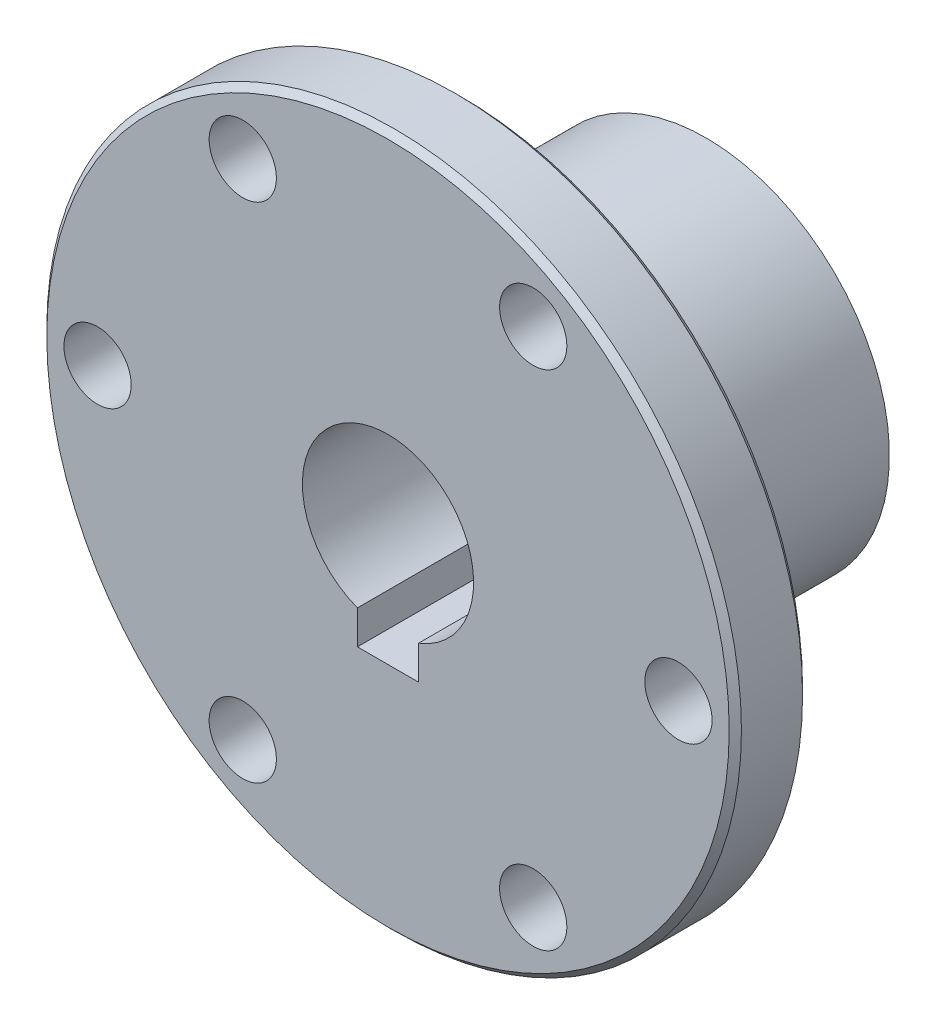
ISO-10303-21;
HEADER;
FILE_DESCRIPTION(('STEP AP214'),'2;1');
FILE_NAME('part.step','',(''),(''),'','','');
FILE_SCHEMA(('AUTOMOTIVE_DESIGN { 1 0 10303 214 1 1 1 1 }'));
ENDSEC;
DATA;
#1=APPLICATION_CONTEXT('core data for automotive mechanical design processes');
#2=APPLICATION_PROTOCOL_DEFINITION('international standard','automotive_design',2000,#1);
#3=PRODUCT_CONTEXT('',#1,'mechanical');
#4=PRODUCT('Part','Part','',(#3));
#5=PRODUCT_RELATED_PRODUCT_CATEGORY('part','',(#4));
#6=PRODUCT_DEFINITION_FORMATION('','',#4);
#7=PRODUCT_DEFINITION_CONTEXT('part definition',#1,'design');
#8=PRODUCT_DEFINITION('design','',#6,#7);
#9=PRODUCT_DEFINITION_SHAPE('','',#8);
#10=(LENGTH_UNIT() NAMED_UNIT(*) SI_UNIT(.MILLI.,.METRE.));
#11=(NAMED_UNIT(*) PLANE_ANGLE_UNIT() SI_UNIT($,.RADIAN.));
#12=(NAMED_UNIT(*) SI_UNIT($,.STERADIAN.) SOLID_ANGLE_UNIT());
#13=UNCERTAINTY_MEASURE_WITH_UNIT(LENGTH_MEASURE(1.E-05),#10,'distance_accuracy_value','');
#14=(GEOMETRIC_REPRESENTATION_CONTEXT(3) GLOBAL_UNCERTAINTY_ASSIGNED_CONTEXT((#13)) GLOBAL_UNIT_ASSIGNED_CONTEXT((#10,
#11,#12)) REPRESENTATION_CONTEXT('',''));
#15=CARTESIAN_POINT('',(0.,0.,0.));
#16=DIRECTION('',(0.,0.,1.));
#17=DIRECTION('',(1.,0.,0.));
#18=AXIS2_PLACEMENT_3D('',#15,#16,#17);
#19=CARTESIAN_POINT('',(0.,0.,26.));
#20=DIRECTION('',(0.,0.,-1.));
#21=DIRECTION('',(-1.,0.,0.));
#22=AXIS2_PLACEMENT_3D('',#19,#20,#21);
#23=CYLINDRICAL_SURFACE('',#22,28.4);
#24=CARTESIAN_POINT('',(0.,0.,20.5));
#25=DIRECTION('',(0.,0.,1.));
#26=DIRECTION('',(1.,0.,0.));
#27=AXIS2_PLACEMENT_3D('',#24,#25,#26);
#28=CIRCLE('',#27,28.4);
#29=CARTESIAN_POINT('',(-28.4,0.,20.5));
#30=VERTEX_POINT('',#29);
#31=EDGE_CURVE('E161',#30,#30,#28,.T.);
#32=CARTESIAN_POINT('',(0.,0.,25.5000000000001));
#33=DIRECTION('',(0.,0.,1.));
#34=DIRECTION('',(1.,0.,0.));
#35=AXIS2_PLACEMENT_3D('',#32,#33,#34);
#36=CIRCLE('',#35,28.4);
#37=CARTESIAN_POINT('',(-28.4,0.,25.5000000000001));
#38=VERTEX_POINT('',#37);
#39=EDGE_CURVE('E157',#38,#38,#36,.F.);
#40=CARTESIAN_POINT('',(-28.4,0.,20.5));
#41=CARTESIAN_POINT('',(-28.4,0.,20.5520833333334));
#42=CARTESIAN_POINT('',(-28.4,0.,20.6041666666667));
#43=CARTESIAN_POINT('',(-28.4,0.,20.7083333333334));
#44=CARTESIAN_POINT('',(-28.4,0.,20.7604166666667));
#45=CARTESIAN_POINT('',(-28.4,0.,20.8645833333334));
#46=CARTESIAN_POINT('',(-28.4,0.,20.9166666666667));
#47=CARTESIAN_POINT('',(-28.4,0.,21.0208333333334));
#48=CARTESIAN_POINT('',(-28.4,0.,21.0729166666667));
#49=CARTESIAN_POINT('',(-28.4,0.,21.1770833333334));
#50=CARTESIAN_POINT('',(-28.4,0.,21.2291666666667));
#51=CARTESIAN_POINT('',(-28.4,0.,21.3333333333334));
#52=CARTESIAN_POINT('',(-28.4,0.,21.3854166666667));
#53=CARTESIAN_POINT('',(-28.4,0.,21.4895833333334));
#54=CARTESIAN_POINT('',(-28.4,0.,21.5416666666667));
#55=CARTESIAN_POINT('',(-28.4,0.,21.6458333333334));
#56=CARTESIAN_POINT('',(-28.4,0.,21.6979166666667));
#57=CARTESIAN_POINT('',(-28.4,0.,21.8020833333334));
#58=CARTESIAN_POINT('',(-28.4,0.,21.8541666666667));
#59=CARTESIAN_POINT('',(-28.4,0.,21.9583333333334));
#60=CARTESIAN_POINT('',(-28.4,0.,22.0104166666667));
#61=CARTESIAN_POINT('',(-28.4,0.,22.1145833333334));
#62=CARTESIAN_POINT('',(-28.4,0.,22.1666666666667));
#63=CARTESIAN_POINT('',(-28.4,0.,22.2708333333334));
#64=CARTESIAN_POINT('',(-28.4,0.,22.3229166666667));
#65=CARTESIAN_POINT('',(-28.4,0.,22.4270833333334));
#66=CARTESIAN_POINT('',(-28.4,0.,22.4791666666667));
#67=CARTESIAN_POINT('',(-28.4,0.,22.5833333333334));
#68=CARTESIAN_POINT('',(-28.4,0.,22.6354166666667));
#69=CARTESIAN_POINT('',(-28.4,0.,22.7395833333334));
#70=CARTESIAN_POINT('',(-28.4,0.,22.7916666666667));
#71=CARTESIAN_POINT('',(-28.4,0.,22.8958333333334));
#72=CARTESIAN_POINT('',(-28.4,0.,22.9479166666667));
#73=CARTESIAN_POINT('',(-28.4,0.,23.0520833333334));
#74=CARTESIAN_POINT('',(-28.4,0.,23.1041666666667));
#75=CARTESIAN_POINT('',(-28.4,0.,23.2083333333334));
#76=CARTESIAN_POINT('',(-28.4,0.,23.2604166666667));
#77=CARTESIAN_POINT('',(-28.4,0.,23.3645833333334));
#78=CARTESIAN_POINT('',(-28.4,0.,23.4166666666667));
#79=CARTESIAN_POINT('',(-28.4,0.,23.5208333333334));
#80=CARTESIAN_POINT('',(-28.4,0.,23.5729166666667));
#81=CARTESIAN_POINT('',(-28.4,0.,23.6770833333334));
#82=CARTESIAN_POINT('',(-28.4,0.,23.7291666666667));
#83=CARTESIAN_POINT('',(-28.4,0.,23.8333333333334));
#84=CARTESIAN_POINT('',(-28.4,0.,23.8854166666667));
#85=CARTESIAN_POINT('',(-28.4,0.,23.9895833333334));
#86=CARTESIAN_POINT('',(-28.4,0.,24.0416666666667));
#87=CARTESIAN_POINT('',(-28.4,0.,24.1458333333334));
#88=CARTESIAN_POINT('',(-28.4,0.,24.1979166666667));
#89=CARTESIAN_POINT('',(-28.4,0.,24.3020833333334));
#90=CARTESIAN_POINT('',(-28.4,0.,24.3541666666667));
#91=CARTESIAN_POINT('',(-28.4,0.,24.4583333333334));
#92=CARTESIAN_POINT('',(-28.4,0.,24.5104166666667));
#93=CARTESIAN_POINT('',(-28.4,0.,24.6145833333334));
#94=CARTESIAN_POINT('',(-28.4,0.,24.6666666666667));
#95=CARTESIAN_POINT('',(-28.4,0.,24.7708333333334));
#96=CARTESIAN_POINT('',(-28.4,0.,24.8229166666667));
#97=CARTESIAN_POINT('',(-28.4,0.,24.9270833333334));
#98=CARTESIAN_POINT('',(-28.4,0.,24.9791666666667));
#99=CARTESIAN_POINT('',(-28.4,0.,25.0833333333334));
#100=CARTESIAN_POINT('',(-28.4,0.,25.1354166666667));
#101=CARTESIAN_POINT('',(-28.4,0.,25.2395833333334));
#102=CARTESIAN_POINT('',(-28.4,0.,25.2916666666667));
#103=CARTESIAN_POINT('',(-28.4,0.,25.3958333333334));
#104=CARTESIAN_POINT('',(-28.4,0.,25.4479166666667));
#105=CARTESIAN_POINT('',(-28.4,0.,25.5000000000001));
#106=B_SPLINE_CURVE_WITH_KNOTS('',3,(#40,#41,#42,#43,#44,#45,#46,#47,#48,#49,#50,#51,#52,#53,
#54,#55,#56,#57,#58,#59,#60,#61,#62,#63,#64,#65,#66,#67,#68,#69,#70,#71,#72,#73,#74,#75,#76,#77,
#78,#79,#80,#81,#82,#83,#84,#85,#86,#87,#88,#89,#90,#91,#92,#93,#94,#95,#96,#97,#98,#99,#100,
#101,#102,#103,#104,#105),.UNSPECIFIED.,.F.,.F.,(4,2,2,2,2,2,2,2,2,2,2,2,2,2,2,2,2,2,2,2,2,2,2,
2,2,2,2,2,2,2,2,2,4),(0.,0.15625,0.3125,0.46875,0.625000000000001,0.781250000000001,
0.937500000000004,1.09375,1.25,1.40625,1.5625,1.71875,1.87500000000001,2.03125000000001,
2.18750000000001,2.34375000000001,2.50000000000001,2.65625000000001,2.81250000000001,
2.96875000000001,3.12500000000001,3.28125000000001,3.43750000000001,3.59375000000001,
3.75000000000001,3.90625000000002,4.06250000000002,4.21875000000002,4.37500000000002,
4.53125000000002,4.68750000000002,4.84375000000002,5.00000000000002),.UNSPECIFIED.);
#107=EDGE_CURVE('BSEAM49',#30,#38,#106,.T.);
#108=ORIENTED_EDGE('',*,*,#31,.T.);
#109=ORIENTED_EDGE('',*,*,#39,.T.);
#110=ORIENTED_EDGE('',*,*,#107,.T.);
#111=ORIENTED_EDGE('',*,*,#107,.F.);
#112=EDGE_LOOP('',(#108,#110,#109,#111));
#113=FACE_BOUND('',#112,.T.);
#114=ADVANCED_FACE('F49',(#113),#23,.T.);
#115=CARTESIAN_POINT('',(0.,0.,26.));
#116=DIRECTION('',(0.,0.,1.));
#117=DIRECTION('',(1.,0.,0.));
#118=AXIS2_PLACEMENT_3D('',#115,#116,#117);
#119=PLANE('',#118);
#120=CARTESIAN_POINT('',(11.8750000000002,-20.5681033398803,26.));
#121=DIRECTION('',(0.,0.,1.));
#122=DIRECTION('',(1.,0.,0.));
#123=AXIS2_PLACEMENT_3D('',#120,#121,#122);
#124=CIRCLE('',#123,2.74999999999999);
#125=CARTESIAN_POINT('',(14.6250000000002,-20.5681033398803,26.));
#126=VERTEX_POINT('',#125);
#127=EDGE_CURVE('E192',#126,#126,#124,.T.);
#128=ORIENTED_EDGE('',*,*,#127,.F.);
#129=EDGE_LOOP('',(#128));
#130=FACE_BOUND('',#129,.T.);
#131=CARTESIAN_POINT('',(-11.8749999999998,-20.5681033398805,26.));
#132=DIRECTION('',(0.,0.,1.));
#133=DIRECTION('',(1.,0.,0.));
#134=AXIS2_PLACEMENT_3D('',#131,#132,#133);
#135=CIRCLE('',#134,2.74999999999999);
#136=CARTESIAN_POINT('',(-9.12499999999982,-20.5681033398805,26.));
#137=VERTEX_POINT('',#136);
#138=EDGE_CURVE('E177',#137,#137,#135,.T.);
#139=ORIENTED_EDGE('',*,*,#138,.F.);
#140=EDGE_LOOP('',(#139));
#141=FACE_BOUND('',#140,.T.);
#142=CARTESIAN_POINT('',(-23.75,0.,26.));
#143=DIRECTION('',(0.,0.,1.));
#144=DIRECTION('',(1.,0.,0.));
#145=AXIS2_PLACEMENT_3D('',#142,#143,#144);
#146=CIRCLE('',#145,2.74999999999999);
#147=CARTESIAN_POINT('',(-21.,0.,26.));
#148=VERTEX_POINT('',#147);
#149=EDGE_CURVE('E176',#148,#148,#146,.T.);
#150=ORIENTED_EDGE('',*,*,#149,.F.);
#151=EDGE_LOOP('',(#150));
#152=FACE_BOUND('',#151,.T.);
#153=CARTESIAN_POINT('',(-11.8750000000001,20.5681033398804,26.));
#154=DIRECTION('',(0.,0.,1.));
#155=DIRECTION('',(1.,0.,0.));
#156=AXIS2_PLACEMENT_3D('',#153,#154,#155);
#157=CIRCLE('',#156,2.74999999999999);
#158=CARTESIAN_POINT('',(-9.12500000000011,20.5681033398804,26.));
#159=VERTEX_POINT('',#158);
#160=EDGE_CURVE('E172',#159,#159,#157,.T.);
#161=ORIENTED_EDGE('',*,*,#160,.F.);
#162=EDGE_LOOP('',(#161));
#163=FACE_BOUND('',#162,.T.);
#164=CARTESIAN_POINT('',(11.875,20.5681033398804,26.));
#165=DIRECTION('',(0.,0.,1.));
#166=DIRECTION('',(1.,0.,0.));
#167=AXIS2_PLACEMENT_3D('',#164,#165,#166);
#168=CIRCLE('',#167,2.74999999999999);
#169=CARTESIAN_POINT('',(14.6249999999999,20.5681033398804,26.));
#170=VERTEX_POINT('',#169);
#171=EDGE_CURVE('E171',#170,#170,#168,.T.);
#172=ORIENTED_EDGE('',*,*,#171,.F.);
#173=EDGE_LOOP('',(#172));
#174=FACE_BOUND('',#173,.T.);
#175=CARTESIAN_POINT('',(23.75,0.,26.));
#176=DIRECTION('',(0.,0.,1.));
#177=DIRECTION('',(1.,0.,0.));
#178=AXIS2_PLACEMENT_3D('',#175,#176,#177);
#179=CIRCLE('',#178,2.74999999999999);
#180=CARTESIAN_POINT('',(26.5,0.,26.));
#181=VERTEX_POINT('',#180);
#182=EDGE_CURVE('E208',#181,#181,#179,.T.);
#183=ORIENTED_EDGE('',*,*,#182,.F.);
#184=EDGE_LOOP('',(#183));
#185=FACE_BOUND('',#184,.T.);
#186=CARTESIAN_POINT('',(0.,0.,26.));
#187=DIRECTION('',(0.,0.,1.));
#188=DIRECTION('',(1.,0.,0.));
#189=AXIS2_PLACEMENT_3D('',#186,#187,#188);
#190=CIRCLE('',#189,27.9000000000001);
#191=CARTESIAN_POINT('',(27.9000000000001,0.,26.));
#192=VERTEX_POINT('',#191);
#193=EDGE_CURVE('E13',#192,#192,#190,.T.);
#194=ORIENTED_EDGE('',*,*,#193,.T.);
#195=EDGE_LOOP('',(#194));
#196=FACE_BOUND('',#195,.T.);
#197=DIRECTION('',(-1.,0.,0.));
#198=VECTOR('',#197,1.);
#199=CARTESIAN_POINT('',(2.5,-9.3,26.));
#200=LINE('',#199,#198);
#201=CARTESIAN_POINT('',(2.5,-9.3,26.));
#202=VERTEX_POINT('',#201);
#203=CARTESIAN_POINT('',(-2.5,-9.3,26.));
#204=VERTEX_POINT('',#203);
#205=EDGE_CURVE('E101',#202,#204,#200,.T.);
#206=ORIENTED_EDGE('',*,*,#205,.T.);
#207=DIRECTION('',(0.,1.,0.));
#208=VECTOR('',#207,1.);
#209=CARTESIAN_POINT('',(-2.5,-6.53834841531101,26.));
#210=LINE('',#209,#208);
#211=CARTESIAN_POINT('',(-2.5,-6.53834841531101,26.));
#212=VERTEX_POINT('',#211);
#213=EDGE_CURVE('E111',#204,#212,#210,.T.);
#214=ORIENTED_EDGE('',*,*,#213,.T.);
#215=CARTESIAN_POINT('',(0.,0.,26.));
#216=DIRECTION('',(0.,0.,-1.));
#217=DIRECTION('',(-1.,0.,0.));
#218=AXIS2_PLACEMENT_3D('',#215,#216,#217);
#219=CIRCLE('',#218,7.);
#220=CARTESIAN_POINT('',(2.5,-6.53834841531101,26.));
#221=VERTEX_POINT('',#220);
#222=EDGE_CURVE('E73',#212,#221,#219,.T.);
#223=ORIENTED_EDGE('',*,*,#222,.T.);
#224=DIRECTION('',(0.,-1.,0.));
#225=VECTOR('',#224,1.);
#226=CARTESIAN_POINT('',(2.5,-6.53834841531101,26.));
#227=LINE('',#226,#225);
#228=EDGE_CURVE('E108',#221,#202,#227,.T.);
#229=ORIENTED_EDGE('',*,*,#228,.T.);
#230=EDGE_LOOP('',(#206,#214,#223,#229));
#231=FACE_BOUND('',#230,.T.);
#232=ADVANCED_FACE('F116',(#130,#141,#152,#163,#174,#185,#196,#231),#119,.T.);
#233=CARTESIAN_POINT('',(0.,0.,20.));
#234=DIRECTION('',(0.,0.,1.));
#235=DIRECTION('',(1.,0.,0.));
#236=AXIS2_PLACEMENT_3D('',#233,#234,#235);
#237=PLANE('',#236);
#238=CARTESIAN_POINT('',(11.8750000000002,-20.5681033398803,20.));
#239=DIRECTION('',(0.,0.,1.));
#240=DIRECTION('',(1.,0.,0.));
#241=AXIS2_PLACEMENT_3D('',#238,#239,#240);
#242=CIRCLE('',#241,2.74999999999999);
#243=CARTESIAN_POINT('',(14.6250000000002,-20.5681033398803,20.));
#244=VERTEX_POINT('',#243);
#245=EDGE_CURVE('E186',#244,#244,#242,.T.);
#246=ORIENTED_EDGE('',*,*,#245,.T.);
#247=EDGE_LOOP('',(#246));
#248=FACE_BOUND('',#247,.T.);
#249=CARTESIAN_POINT('',(-11.8749999999998,-20.5681033398805,20.));
#250=DIRECTION('',(0.,0.,1.));
#251=DIRECTION('',(1.,0.,0.));
#252=AXIS2_PLACEMENT_3D('',#249,#250,#251);
#253=CIRCLE('',#252,2.74999999999999);
#254=CARTESIAN_POINT('',(-9.12499999999982,-20.5681033398805,20.));
#255=VERTEX_POINT('',#254);
#256=EDGE_CURVE('E173',#255,#255,#253,.T.);
#257=ORIENTED_EDGE('',*,*,#256,.T.);
#258=EDGE_LOOP('',(#257));
#259=FACE_BOUND('',#258,.T.);
#260=CARTESIAN_POINT('',(-23.75,0.,20.));
#261=DIRECTION('',(0.,0.,1.));
#262=DIRECTION('',(1.,0.,0.));
#263=AXIS2_PLACEMENT_3D('',#260,#261,#262);
#264=CIRCLE('',#263,2.74999999999999);
#265=CARTESIAN_POINT('',(-21.,0.,20.));
#266=VERTEX_POINT('',#265);
#267=EDGE_CURVE('E183',#266,#266,#264,.T.);
#268=ORIENTED_EDGE('',*,*,#267,.T.);
#269=EDGE_LOOP('',(#268));
#270=FACE_BOUND('',#269,.T.);
#271=CARTESIAN_POINT('',(-11.8750000000001,20.5681033398804,20.));
#272=DIRECTION('',(0.,0.,1.));
#273=DIRECTION('',(1.,0.,0.));
#274=AXIS2_PLACEMENT_3D('',#271,#272,#273);
#275=CIRCLE('',#274,2.74999999999999);
#276=CARTESIAN_POINT('',(-9.12500000000011,20.5681033398804,20.));
#277=VERTEX_POINT('',#276);
#278=EDGE_CURVE('E168',#277,#277,#275,.T.);
#279=ORIENTED_EDGE('',*,*,#278,.T.);
#280=EDGE_LOOP('',(#279));
#281=FACE_BOUND('',#280,.T.);
#282=CARTESIAN_POINT('',(11.875,20.5681033398804,20.));
#283=DIRECTION('',(0.,0.,1.));
#284=DIRECTION('',(1.,0.,0.));
#285=AXIS2_PLACEMENT_3D('',#282,#283,#284);
#286=CIRCLE('',#285,2.74999999999999);
#287=CARTESIAN_POINT('',(14.6249999999999,20.5681033398804,20.));
#288=VERTEX_POINT('',#287);
#289=EDGE_CURVE('E205',#288,#288,#286,.T.);
#290=ORIENTED_EDGE('',*,*,#289,.T.);
#291=EDGE_LOOP('',(#290));
#292=FACE_BOUND('',#291,.T.);
#293=CARTESIAN_POINT('',(23.75,0.,20.));
#294=DIRECTION('',(0.,0.,1.));
#295=DIRECTION('',(1.,0.,0.));
#296=AXIS2_PLACEMENT_3D('',#293,#294,#295);
#297=CIRCLE('',#296,2.74999999999999);
#298=CARTESIAN_POINT('',(26.5,0.,20.));
#299=VERTEX_POINT('',#298);
#300=EDGE_CURVE('E126',#299,#299,#297,.T.);
#301=ORIENTED_EDGE('',*,*,#300,.T.);
#302=EDGE_LOOP('',(#301));
#303=FACE_BOUND('',#302,.T.);
#304=CARTESIAN_POINT('',(0.,0.,20.));
#305=DIRECTION('',(0.,0.,1.));
#306=DIRECTION('',(1.,0.,0.));
#307=AXIS2_PLACEMENT_3D('',#304,#305,#306);
#308=CIRCLE('',#307,27.9);
#309=CARTESIAN_POINT('',(27.9,0.,20.));
#310=VERTEX_POINT('',#309);
#311=EDGE_CURVE('E65',#310,#310,#308,.F.);
#312=ORIENTED_EDGE('',*,*,#311,.T.);
#313=EDGE_LOOP('',(#312));
#314=FACE_BOUND('',#313,.T.);
#315=CARTESIAN_POINT('',(0.,0.,20.));
#316=DIRECTION('',(0.,0.,1.));
#317=DIRECTION('',(1.,0.,0.));
#318=AXIS2_PLACEMENT_3D('',#315,#316,#317);
#319=CIRCLE('',#318,15.);
#320=CARTESIAN_POINT('',(15.,0.,20.));
#321=VERTEX_POINT('',#320);
#322=EDGE_CURVE('E153',#321,#321,#319,.F.);
#323=ORIENTED_EDGE('',*,*,#322,.F.);
#324=EDGE_LOOP('',(#323));
#325=FACE_BOUND('',#324,.T.);
#326=ADVANCED_FACE('F217',(#248,#259,#270,#281,#292,#303,#314,#325),#237,.F.);
#327=CARTESIAN_POINT('',(0.,0.,108.427069801574));
#328=DIRECTION('',(0.,0.,-1.));
#329=DIRECTION('',(-1.,0.,0.));
#330=AXIS2_PLACEMENT_3D('',#327,#328,#329);
#331=CYLINDRICAL_SURFACE('',#330,15.);
#332=CARTESIAN_POINT('',(-15.,0.,14.2));
#333=CARTESIAN_POINT('',(-14.9999966762032,0.220509111665708,14.1999947661303));
#334=CARTESIAN_POINT('',(-14.995089723243,0.441074320443681,14.1817047716207));
#335=CARTESIAN_POINT('',(-14.9759914724332,0.875850902708927,14.1091575385226));
#336=CARTESIAN_POINT('',(-14.9617957066517,1.09005916663817,14.0548829911478));
#337=CARTESIAN_POINT('',(-14.9256866650558,1.50578317809062,13.9122566662719));
#338=CARTESIAN_POINT('',(-14.9037833426075,1.70731490203057,13.823948824668));
#339=CARTESIAN_POINT('',(-14.8545739830336,2.09270737278532,13.6159255146668));
#340=CARTESIAN_POINT('',(-14.8272675859036,2.27656694089925,13.4962079532814));
#341=CARTESIAN_POINT('',(-14.7694922980399,2.62565900748003,13.2258329671733));
#342=CARTESIAN_POINT('',(-14.7389693535736,2.79042337972557,13.0745826639835));
#343=CARTESIAN_POINT('',(-14.6785481935918,3.09257427321275,12.7467030338733));
#344=CARTESIAN_POINT('',(-14.6486500589449,3.22995726991329,12.5700704447649));
#345=CARTESIAN_POINT('',(-14.5923107492874,3.4757281848683,12.1927035303491));
#346=CARTESIAN_POINT('',(-14.5659377712648,3.58357755472975,11.9916073434765));
#347=CARTESIAN_POINT('',(-14.5204295463637,3.76375096153988,11.5733197778151));
#348=CARTESIAN_POINT('',(-14.5012929650653,3.83608154902738,11.3561313753371));
#349=CARTESIAN_POINT('',(-14.472982316048,3.94153840453008,10.91700892435));
#350=CARTESIAN_POINT('',(-14.4635929562298,3.97551340489384,10.6952929201385));
#351=CARTESIAN_POINT('',(-14.4551966183274,4.0059406941164,10.2491246333869));
#352=CARTESIAN_POINT('',(-14.4561877002889,4.00239999411507,10.0246728699519));
#353=CARTESIAN_POINT('',(-14.4682475760406,3.95857020005398,9.58602916925187));
#354=CARTESIAN_POINT('',(-14.4790347102306,3.91930812129529,9.37172563592302));
#355=CARTESIAN_POINT('',(-14.5090202616138,3.80679497444366,8.95286333108751));
#356=CARTESIAN_POINT('',(-14.5282193510522,3.7335411898599,8.74830533984931));
#357=CARTESIAN_POINT('',(-14.5731132349677,3.55428713930512,8.35206371238285));
#358=CARTESIAN_POINT('',(-14.5988788563741,3.44792682275569,8.16055132142748));
#359=CARTESIAN_POINT('',(-14.6539645928489,3.20573007647555,7.79773168229695));
#360=CARTESIAN_POINT('',(-14.6832854071037,3.06988784448503,7.62642842168706));
#361=CARTESIAN_POINT('',(-14.7433502125973,2.76733214526838,7.3030220050904));
#362=CARTESIAN_POINT('',(-14.7741094297766,2.59975625456598,7.15172736337009));
#363=CARTESIAN_POINT('',(-14.8327276255263,2.24123533641274,6.87922243929942));
#364=CARTESIAN_POINT('',(-14.8605864897711,2.05028938841018,6.75801334259514));
#365=CARTESIAN_POINT('',(-14.9104364079659,1.6491965109949,6.5487641943507));
#366=CARTESIAN_POINT('',(-14.9324014566712,1.43896980510358,6.46087045910281));
#367=CARTESIAN_POINT('',(-14.96780088802,1.00600458878079,6.32190562237325));
#368=CARTESIAN_POINT('',(-14.981237134675,0.783268823856646,6.27082647455208));
#369=CARTESIAN_POINT('',(-14.9977831711677,0.33850816629103,6.20821024616435));
#370=CARTESIAN_POINT('',(-15.0011799494192,0.116648475282761,6.19557392029827));
#371=CARTESIAN_POINT('',(-14.9980894338339,-0.326020091802397,6.20716632849389));
#372=CARTESIAN_POINT('',(-14.9916031616071,-0.546829074124228,6.23139125221153));
#373=CARTESIAN_POINT('',(-14.9696607099204,-0.977204899803559,6.31511689491995));
#374=CARTESIAN_POINT('',(-14.9543605309265,-1.18689970405556,6.37400449239553));
#375=CARTESIAN_POINT('',(-14.9165258978828,-1.59341394235213,6.52467188901589));
#376=CARTESIAN_POINT('',(-14.8939906599234,-1.79023197843206,6.61645525250108));
#377=CARTESIAN_POINT('',(-14.8435132111904,-2.1696769493359,6.83234777436107));
#378=CARTESIAN_POINT('',(-14.8154737320985,-2.35195037692236,6.9570549335955));
#379=CARTESIAN_POINT('',(-14.7572290473119,-2.69336927079429,7.23450326031597));
#380=CARTESIAN_POINT('',(-14.7270234145527,-2.85251015759837,7.38724996520206));
#381=CARTESIAN_POINT('',(-14.6667949173317,-3.14777848957546,7.72157115498916));
#382=CARTESIAN_POINT('',(-14.6368012285772,-3.28313038499627,7.90383712279052));
#383=CARTESIAN_POINT('',(-14.5813289436636,-3.52134382370242,8.28912939219907));
#384=CARTESIAN_POINT('',(-14.5558501591602,-3.62420672244342,8.49215482724395));
#385=CARTESIAN_POINT('',(-14.5125853674305,-3.79374823172205,8.91219061415286));
#386=CARTESIAN_POINT('',(-14.4947549662348,-3.8606362450784,9.12911162363758));
#387=CARTESIAN_POINT('',(-14.4687965026614,-3.95682410237657,9.57167863934708));
#388=CARTESIAN_POINT('',(-14.4606659608681,-3.98613355205236,9.79732240068679));
#389=CARTESIAN_POINT('',(-14.4552348910192,-4.00577979307212,10.2429895757886));
#390=CARTESIAN_POINT('',(-14.4575879532022,-3.99736311235129,10.4629546405733));
#391=CARTESIAN_POINT('',(-14.4720479199639,-3.94468751999858,10.8982070280705));
#392=CARTESIAN_POINT('',(-14.4841545735456,-3.9004295306998,11.1134944710095));
#393=CARTESIAN_POINT('',(-14.5165514219021,-3.77805031399794,11.5317115042402));
#394=CARTESIAN_POINT('',(-14.5367777005106,-3.70019322151266,11.7347236854591));
#395=CARTESIAN_POINT('',(-14.5831363626058,-3.51303109124666,12.1249576610735));
#396=CARTESIAN_POINT('',(-14.6092696723953,-3.40372112049204,12.3121769726024));
#397=CARTESIAN_POINT('',(-14.6654584288421,-3.15297818537663,12.6714607189918));
#398=CARTESIAN_POINT('',(-14.6956066620426,-3.01069459535827,12.842917069952));
#399=CARTESIAN_POINT('',(-14.7559100756513,-2.69966107022192,13.159924903335));
#400=CARTESIAN_POINT('',(-14.7860652559664,-2.53090470871747,13.3054700773378));
#401=CARTESIAN_POINT('',(-14.8437562480818,-2.16735996217739,13.5695844752936));
#402=CARTESIAN_POINT('',(-14.8712222262917,-1.97209192350357,13.6875100212986));
#403=CARTESIAN_POINT('',(-14.9196762020573,-1.56377728083377,13.8886748318588));
#404=CARTESIAN_POINT('',(-14.9406683536717,-1.35074218939259,13.9719363513272));
#405=CARTESIAN_POINT('',(-14.9710950502695,-0.948749409761983,14.090550570831));
#406=CARTESIAN_POINT('',(-14.9818554118521,-0.761524033130073,14.131498767185));
#407=CARTESIAN_POINT('',(-14.9963089807291,-0.382879590634153,14.1862244123341));
#408=CARTESIAN_POINT('',(-15.0000028859454,-0.191460940809721,14.2000045444));
#409=CARTESIAN_POINT('',(-15.,0.,14.2));
#410=B_SPLINE_CURVE_WITH_KNOTS('',3,(#332,#333,#334,#335,#336,#337,#338,#339,#340,#341,#342,
#343,#344,#345,#346,#347,#348,#349,#350,#351,#352,#353,#354,#355,#356,#357,#358,#359,#360,#361,
#362,#363,#364,#365,#366,#367,#368,#369,#370,#371,#372,#373,#374,#375,#376,#377,#378,#379,#380,
#381,#382,#383,#384,#385,#386,#387,#388,#389,#390,#391,#392,#393,#394,#395,#396,#397,#398,#399,
#400,#401,#402,#403,#404,#405,#406,#407,#408,#409),.UNSPECIFIED.,.T.,.F.,(4,2,2,2,2,2,2,2,2,2,2,
2,2,2,2,2,2,2,2,2,2,2,2,2,2,2,2,2,2,2,2,2,2,2,2,2,2,2,4),(0.,0.660825197899138,1.3219684875229,
1.98226110594386,2.64259773417351,3.31669795909934,3.99088489850298,4.67665165046458,
5.362291882594,6.03244316500936,6.7024692080864,7.35382004091994,8.00522293625879,
8.66397346692996,9.3228537623526,10.0032251962464,10.683623438752,11.3669761920608,
12.0501795438028,12.7136543504909,13.377060578507,14.0290707128423,14.6811515155123,
15.346005720091,16.0109913651777,16.6947299276558,17.3784399604822,18.0581259539877,
18.7376381732797,19.394866848109,20.0520786104838,20.7042153090379,21.3564543425319,
22.0278867914997,22.6994824867209,23.3854450456898,24.0709665229755,24.6447963799386,
25.2185695593995),.UNSPECIFIED.);
#411=CARTESIAN_POINT('',(-15.,0.,14.2));
#412=VERTEX_POINT('',#411);
#413=EDGE_CURVE('E279',#412,#412,#410,.T.);
#414=ORIENTED_EDGE('',*,*,#413,.F.);
#415=EDGE_LOOP('',(#414));
#416=FACE_BOUND('',#415,.T.);
#417=CARTESIAN_POINT('',(0.,0.,0.));
#418=DIRECTION('',(0.,0.,-1.));
#419=DIRECTION('',(-1.,0.,0.));
#420=AXIS2_PLACEMENT_3D('',#417,#418,#419);
#421=CIRCLE('',#420,15.);
#422=CARTESIAN_POINT('',(-15.,0.,0.));
#423=VERTEX_POINT('',#422);
#424=EDGE_CURVE('E144',#423,#423,#421,.T.);
#425=ORIENTED_EDGE('',*,*,#424,.F.);
#426=EDGE_LOOP('',(#425));
#427=FACE_BOUND('',#426,.T.);
#428=ORIENTED_EDGE('',*,*,#322,.T.);
#429=EDGE_LOOP('',(#428));
#430=FACE_BOUND('',#429,.T.);
#431=ADVANCED_FACE('F260',(#416,#427,#430),#331,.T.);
#432=CARTESIAN_POINT('',(0.,0.,0.));
#433=DIRECTION('',(0.,0.,1.));
#434=DIRECTION('',(1.,0.,0.));
#435=AXIS2_PLACEMENT_3D('',#432,#433,#434);
#436=PLANE('',#435);
#437=DIRECTION('',(0.,1.,0.));
#438=VECTOR('',#437,1.);
#439=CARTESIAN_POINT('',(-2.5,-6.53834841531101,0.));
#440=LINE('',#439,#438);
#441=CARTESIAN_POINT('',(-2.5,-9.3,0.));
#442=VERTEX_POINT('',#441);
#443=CARTESIAN_POINT('',(-2.5,-6.53834841531101,0.));
#444=VERTEX_POINT('',#443);
#445=EDGE_CURVE('E135',#442,#444,#440,.T.);
#446=ORIENTED_EDGE('',*,*,#445,.F.);
#447=DIRECTION('',(-1.,0.,0.));
#448=VECTOR('',#447,1.);
#449=CARTESIAN_POINT('',(2.5,-9.3,0.));
#450=LINE('',#449,#448);
#451=CARTESIAN_POINT('',(2.5,-9.3,0.));
#452=VERTEX_POINT('',#451);
#453=EDGE_CURVE('E81',#452,#442,#450,.T.);
#454=ORIENTED_EDGE('',*,*,#453,.F.);
#455=DIRECTION('',(0.,-1.,0.));
#456=VECTOR('',#455,1.);
#457=CARTESIAN_POINT('',(2.5,-6.53834841531101,0.));
#458=LINE('',#457,#456);
#459=CARTESIAN_POINT('',(2.5,-6.53834841531101,0.));
#460=VERTEX_POINT('',#459);
#461=EDGE_CURVE('E119',#460,#452,#458,.T.);
#462=ORIENTED_EDGE('',*,*,#461,.F.);
#463=CARTESIAN_POINT('',(0.,0.,0.));
#464=DIRECTION('',(0.,0.,-1.));
#465=DIRECTION('',(-1.,0.,0.));
#466=AXIS2_PLACEMENT_3D('',#463,#464,#465);
#467=CIRCLE('',#466,7.);
#468=EDGE_CURVE('E123',#444,#460,#467,.T.);
#469=ORIENTED_EDGE('',*,*,#468,.F.);
#470=EDGE_LOOP('',(#446,#454,#462,#469));
#471=FACE_BOUND('',#470,.T.);
#472=ORIENTED_EDGE('',*,*,#424,.T.);
#473=EDGE_LOOP('',(#472));
#474=FACE_BOUND('',#473,.T.);
#475=ADVANCED_FACE('F246',(#471,#474),#436,.F.);
#476=CARTESIAN_POINT('',(2.5,-9.3,26.));
#477=DIRECTION('',(0.,-1.,0.));
#478=DIRECTION('',(0.,0.,-1.));
#479=AXIS2_PLACEMENT_3D('',#476,#477,#478);
#480=PLANE('',#479);
#481=ORIENTED_EDGE('',*,*,#453,.T.);
#482=DIRECTION('',(0.,0.,-1.));
#483=VECTOR('',#482,1.);
#484=CARTESIAN_POINT('',(-2.5,-9.3,26.));
#485=LINE('',#484,#483);
#486=EDGE_CURVE('E97',#204,#442,#485,.T.);
#487=ORIENTED_EDGE('',*,*,#486,.F.);
#488=ORIENTED_EDGE('',*,*,#205,.F.);
#489=DIRECTION('',(0.,0.,-1.));
#490=VECTOR('',#489,1.);
#491=CARTESIAN_POINT('',(2.5,-9.3,26.));
#492=LINE('',#491,#490);
#493=EDGE_CURVE('E141',#202,#452,#492,.T.);
#494=ORIENTED_EDGE('',*,*,#493,.T.);
#495=EDGE_LOOP('',(#481,#487,#488,#494));
#496=FACE_BOUND('',#495,.T.);
#497=ADVANCED_FACE('F99',(#496),#480,.F.);
#498=CARTESIAN_POINT('',(2.5,-6.53834841531101,26.));
#499=DIRECTION('',(1.,0.,0.));
#500=DIRECTION('',(0.,1.,0.));
#501=AXIS2_PLACEMENT_3D('',#498,#499,#500);
#502=PLANE('',#501);
#503=ORIENTED_EDGE('',*,*,#461,.T.);
#504=ORIENTED_EDGE('',*,*,#493,.F.);
#505=ORIENTED_EDGE('',*,*,#228,.F.);
#506=DIRECTION('',(0.,0.,-1.));
#507=VECTOR('',#506,1.);
#508=CARTESIAN_POINT('',(2.5,-6.53834841531101,26.));
#509=LINE('',#508,#507);
#510=EDGE_CURVE('E145',#221,#460,#509,.T.);
#511=ORIENTED_EDGE('',*,*,#510,.T.);
#512=EDGE_LOOP('',(#503,#504,#505,#511));
#513=FACE_BOUND('',#512,.T.);
#514=ADVANCED_FACE('F348',(#513),#502,.F.);
#515=CARTESIAN_POINT('',(0.,0.,26.));
#516=DIRECTION('',(0.,0.,-1.));
#517=DIRECTION('',(-1.,0.,0.));
#518=AXIS2_PLACEMENT_3D('',#515,#516,#517);
#519=CYLINDRICAL_SURFACE('',#518,7.);
#520=CARTESIAN_POINT('',(-6.99999999999999,0.,6.2));
#521=CARTESIAN_POINT('',(-6.99999916766607,-0.103174353693697,6.20000092622147));
#522=CARTESIAN_POINT('',(-6.99771279419803,-0.206380943793602,6.20399838481107));
#523=CARTESIAN_POINT('',(-6.98862259173911,-0.412022231403472,6.21993883172418));
#524=CARTESIAN_POINT('',(-6.9818159384365,-0.514456405807251,6.23188678759966));
#525=CARTESIAN_POINT('',(-6.96383614374592,-0.717934780638679,6.26360740964748));
#526=CARTESIAN_POINT('',(-6.95265431743131,-0.818975800015573,6.28339564012929));
#527=CARTESIAN_POINT('',(-6.92620670688287,-1.01874471471559,6.33054095618499));
#528=CARTESIAN_POINT('',(-6.91093918050343,-1.11747160371513,6.35790127067176));
#529=CARTESIAN_POINT('',(-6.85970259630011,-1.40816161924453,6.45057204533383));
#530=CARTESIAN_POINT('',(-6.81818653388811,-1.59584032587965,6.52666486949525));
#531=CARTESIAN_POINT('',(-6.72398397587056,-1.95516204193538,6.70462659088825));
#532=CARTESIAN_POINT('',(-6.67130059340362,-2.12680950125059,6.80648830599675));
#533=CARTESIAN_POINT('',(-6.55482935189651,-2.46335779064466,7.04136955995345));
#534=CARTESIAN_POINT('',(-6.4905142322253,-2.62687541249465,7.1761083987552));
#535=CARTESIAN_POINT('',(-6.3592893111133,-2.93033153816757,7.46911523181844));
#536=CARTESIAN_POINT('',(-6.29237653599831,-3.07024197621333,7.62741081714533));
#537=CARTESIAN_POINT('',(-6.15495683988651,-3.33788766479095,7.98339266783645));
#538=CARTESIAN_POINT('',(-6.08484959478128,-3.46264734932395,8.18349020981621));
#539=CARTESIAN_POINT('',(-5.9582603829287,-3.67622523435092,8.60590059000562));
#540=CARTESIAN_POINT('',(-5.90175784209801,-3.76509784562976,8.82817915503341));
#541=CARTESIAN_POINT('',(-5.82184477812116,-3.88718686207776,9.23829031856916));
#542=CARTESIAN_POINT('',(-5.7938785104293,-3.92836679668127,9.422863020078));
#543=CARTESIAN_POINT('',(-5.75562678316024,-3.98421352589058,9.79769947964964));
#544=CARTESIAN_POINT('',(-5.74532237121861,-3.99890874126274,9.98795691419463));
#545=CARTESIAN_POINT('',(-5.74388373656896,-4.000975196418,10.3689493476655));
#546=CARTESIAN_POINT('',(-5.75277569403422,-3.9883091206227,10.5596846439882));
#547=CARTESIAN_POINT('',(-5.78845897302995,-3.93632981744011,10.9358050940159));
#548=CARTESIAN_POINT('',(-5.81526260986988,-3.89699825572749,11.121186475047));
#549=CARTESIAN_POINT('',(-5.88307389939548,-3.79383546739156,11.4813295501423));
#550=CARTESIAN_POINT('',(-5.92402626197588,-3.73009950434547,11.6561295144087));
#551=CARTESIAN_POINT('',(-6.01571820888122,-3.58033837481382,11.9931008623878));
#552=CARTESIAN_POINT('',(-6.06646153595043,-3.49430468035283,12.1552673833917));
#553=CARTESIAN_POINT('',(-6.18185421346707,-3.28648201894194,12.4899407804475));
#554=CARTESIAN_POINT('',(-6.24742890906936,-3.1611726088396,12.6599401940535));
#555=CARTESIAN_POINT('',(-6.37944698360956,-2.88547978627879,12.9781887456039));
#556=CARTESIAN_POINT('',(-6.44589105816034,-2.73507500002897,13.1264191387401));
#557=CARTESIAN_POINT('',(-6.54542571666137,-2.48331031323023,13.3379989901695));
#558=CARTESIAN_POINT('',(-6.58026752098845,-2.38969010220767,13.4098883108521));
#559=CARTESIAN_POINT('',(-6.64745587466658,-2.19586698303155,13.54546570153));
#560=CARTESIAN_POINT('',(-6.67980343263155,-2.09566676634966,13.6091570936198));
#561=CARTESIAN_POINT('',(-6.74110581212484,-1.88920400254899,13.7277590049286));
#562=CARTESIAN_POINT('',(-6.77006053829395,-1.78294128516185,13.7826692773604));
#563=CARTESIAN_POINT('',(-6.82371510380378,-1.5650825805267,13.8830541007004));
#564=CARTESIAN_POINT('',(-6.84841752119956,-1.45348987750212,13.9285343721975));
#565=CARTESIAN_POINT('',(-6.89129649283952,-1.23357577903309,14.0066993147919));
#566=CARTESIAN_POINT('',(-6.90980443827147,-1.12555499053736,14.0400476637669));
#567=CARTESIAN_POINT('',(-6.94194552986212,-0.906444721241714,14.0975861592155));
#568=CARTESIAN_POINT('',(-6.95558130240596,-0.795356928634565,14.1217812402487));
#569=CARTESIAN_POINT('',(-6.97757559140465,-0.571076021606546,14.1606588010673));
#570=CARTESIAN_POINT('',(-6.98593711776119,-0.457884145982394,14.1753467065239));
#571=CARTESIAN_POINT('',(-6.99713394609541,-0.230391688469552,14.1949905747081));
#572=CARTESIAN_POINT('',(-6.99996986667267,-0.116091232128084,14.1999476268193));
#573=CARTESIAN_POINT('',(-7.00002603570933,0.0985985157551607,14.2000452461423));
#574=CARTESIAN_POINT('',(-6.99788721407676,0.198989300897787,14.1963061961282));
#575=CARTESIAN_POINT('',(-6.98933343073184,0.39905637814449,14.1813088213231));
#576=CARTESIAN_POINT('',(-6.98291713194041,0.498732436984937,14.1700481453757));
#577=CARTESIAN_POINT('',(-6.96596218341932,0.69657750313831,14.1401499654246));
#578=CARTESIAN_POINT('',(-6.95542513725049,0.794747081263247,14.1215153309134));
#579=CARTESIAN_POINT('',(-6.93048013582528,0.9889666750444,14.0770977027035));
#580=CARTESIAN_POINT('',(-6.91607068803824,1.08501585796257,14.0513119526444));
#581=CARTESIAN_POINT('',(-6.86784025244503,1.36702487624933,13.9642517890796));
#582=CARTESIAN_POINT('',(-6.82881174027116,1.54910864022513,13.8929238440903));
#583=CARTESIAN_POINT('',(-6.73998795964161,1.89874210569062,13.7259628625689));
#584=CARTESIAN_POINT('',(-6.69019009930531,2.06628829476745,13.6303239740996));
#585=CARTESIAN_POINT('',(-6.57794997192013,2.40101022734591,13.4062140714796));
#586=CARTESIAN_POINT('',(-6.51473109707346,2.5663321281279,13.275361795316));
#587=CARTESIAN_POINT('',(-6.38501165185068,2.87394702055108,12.99007620557));
#588=CARTESIAN_POINT('',(-6.31850738648143,3.01621327559794,12.8356159123281));
#589=CARTESIAN_POINT('',(-6.18084352273239,3.28985374296219,12.4871950997602));
#590=CARTESIAN_POINT('',(-6.10999195942493,3.41824351694382,12.2907504418171));
#591=CARTESIAN_POINT('',(-5.98062693471643,3.63986774300698,11.8752906982198));
#592=CARTESIAN_POINT('',(-5.92209712227822,3.73314891565779,11.6563061054957));
#593=CARTESIAN_POINT('',(-5.83702467135119,3.86444214295347,11.2495294788343));
#594=CARTESIAN_POINT('',(-5.80632211246573,3.90999905451076,11.0650470183144));
#595=CARTESIAN_POINT('',(-5.76238064526141,3.97448674862481,10.689531814936));
#596=CARTESIAN_POINT('',(-5.74912186682822,3.99344782797956,10.4985067797353));
#597=CARTESIAN_POINT('',(-5.74198624338643,4.00370381772299,10.1149544549286));
#598=CARTESIAN_POINT('',(-5.74814842005171,3.9949430276323,9.92242491715762));
#599=CARTESIAN_POINT('',(-5.77900279264678,3.95016772474909,9.54204572037987));
#600=CARTESIAN_POINT('',(-5.80370670835904,3.9141359745247,9.35419909895343));
#601=CARTESIAN_POINT('',(-5.86767618941698,3.81754070421716,8.99124865360563));
#602=CARTESIAN_POINT('',(-5.90668241023302,3.75741242514337,8.81598058599029));
#603=CARTESIAN_POINT('',(-5.99499093748335,3.61484445738469,8.47760210613397));
#604=CARTESIAN_POINT('',(-6.04429703915073,3.53239654118208,8.31449620547462));
#605=CARTESIAN_POINT('',(-6.15687101376706,3.33286050522202,7.97831205282258));
#606=CARTESIAN_POINT('',(-6.22111967308758,3.21239325811873,7.80756571565306));
#607=CARTESIAN_POINT('',(-6.35125248551338,2.94678350974007,7.48708986044926));
#608=CARTESIAN_POINT('',(-6.41713801476199,2.80161960176932,7.33737878277491));
#609=CARTESIAN_POINT('',(-6.55284552282303,2.4690476683285,7.04425692233428));
#610=CARTESIAN_POINT('',(-6.62213671268147,2.27863050588138,6.90394980882597));
#611=CARTESIAN_POINT('',(-6.71654843840246,1.97466957376768,6.71937044299449));
#612=CARTESIAN_POINT('',(-6.74643988436931,1.87025550480297,6.66214277062577));
#613=CARTESIAN_POINT('',(-6.80223377050488,1.65585314541166,6.55687137778825));
#614=CARTESIAN_POINT('',(-6.82813730928139,1.54586640130947,6.50882512709429));
#615=CARTESIAN_POINT('',(-6.87097539991195,1.34112548315164,6.43022773804321));
#616=CARTESIAN_POINT('',(-6.88868575445997,1.24713982863985,6.3980848492583));
#617=CARTESIAN_POINT('',(-6.92049045413031,1.05647742318428,6.34075678145627));
#618=CARTESIAN_POINT('',(-6.9345854387517,0.959801151524318,6.31557037189256));
#619=CARTESIAN_POINT('',(-6.95880963464549,0.764604083132335,6.27248834292975));
#620=CARTESIAN_POINT('',(-6.96894852493489,0.66608841404704,6.25457492494885));
#621=CARTESIAN_POINT('',(-6.98506655367338,0.467694279786056,6.22617404906706));
#622=CARTESIAN_POINT('',(-6.99104805863874,0.367816622968038,6.21568236641729));
#623=CARTESIAN_POINT('',(-6.99658555791355,0.223113454646577,6.2059777315518));
#624=CARTESIAN_POINT('',(-6.99786511874742,0.178534436572909,6.20373702273038));
#625=CARTESIAN_POINT('',(-6.99957256458765,0.0893056299289664,6.20074787823879));
#626=CARTESIAN_POINT('',(-7.00000036025004,0.0446558344262,6.19999959911362));
#627=CARTESIAN_POINT('',(-6.99999999999999,0.,6.2));
#628=B_SPLINE_CURVE_WITH_KNOTS('',3,(#520,#521,#522,#523,#524,#525,#526,#527,#528,#529,#530,
#531,#532,#533,#534,#535,#536,#537,#538,#539,#540,#541,#542,#543,#544,#545,#546,#547,#548,#549,
#550,#551,#552,#553,#554,#555,#556,#557,#558,#559,#560,#561,#562,#563,#564,#565,#566,#567,#568,
#569,#570,#571,#572,#573,#574,#575,#576,#577,#578,#579,#580,#581,#582,#583,#584,#585,#586,#587,
#588,#589,#590,#591,#592,#593,#594,#595,#596,#597,#598,#599,#600,#601,#602,#603,#604,#605,#606,
#607,#608,#609,#610,#611,#612,#613,#614,#615,#616,#617,#618,#619,#620,#621,#622,#623,#624,#625,
#626,#627),.UNSPECIFIED.,.T.,.F.,(4,2,2,2,2,2,2,2,2,2,2,2,2,2,2,2,2,2,2,2,2,2,2,2,2,2,2,2,2,2,2,
2,2,2,2,2,2,2,2,2,2,2,2,2,2,2,2,2,2,2,2,2,2,4),(0.,0.309476324047614,0.619146193855397,
0.929433917393156,1.23985415925135,1.85706150441802,2.47409701507639,3.13570852611815,
3.79810114556278,4.53248005222482,5.26574129924115,5.83676638409033,6.40717833593583,
6.97836871188835,7.54995221869045,8.11932690485234,8.6889196758526,9.34979048117592,
10.0112270520966,10.3800420446256,10.7487071063677,11.1173825273551,11.4858336375217,
11.829013046234,12.172007181154,12.5148053990004,12.8575652378825,13.1586456412119,
13.4598202021895,13.7608776795699,14.0620513596593,14.6575858081394,15.2532637449138,
15.910945217437,16.5693839988404,17.3012585698566,18.0321557302083,18.6071545432669,
19.1814978096213,19.7569958138959,20.3328578831258,20.8987562552321,21.4648635148624,
22.118143381826,22.7719924141757,23.5072264951886,23.87508904646,24.2428500751504,
24.5452250849504,24.8475465726779,25.1491236891176,25.4505289973437,25.5844622240579,
25.7184094986542),.UNSPECIFIED.);
#629=CARTESIAN_POINT('',(-6.99999999999999,0.,6.2));
#630=VERTEX_POINT('',#629);
#631=EDGE_CURVE('E54',#630,#630,#628,.T.);
#632=ORIENTED_EDGE('',*,*,#631,.T.);
#633=EDGE_LOOP('',(#632));
#634=FACE_BOUND('',#633,.T.);
#635=ORIENTED_EDGE('',*,*,#468,.T.);
#636=ORIENTED_EDGE('',*,*,#510,.F.);
#637=ORIENTED_EDGE('',*,*,#222,.F.);
#638=DIRECTION('',(0.,0.,-1.));
#639=VECTOR('',#638,1.);
#640=CARTESIAN_POINT('',(-2.5,-6.53834841531101,26.));
#641=LINE('',#640,#639);
#642=EDGE_CURVE('E107',#212,#444,#641,.T.);
#643=ORIENTED_EDGE('',*,*,#642,.T.);
#644=EDGE_LOOP('',(#635,#636,#637,#643));
#645=FACE_BOUND('',#644,.T.);
#646=ADVANCED_FACE('F253',(#634,#645),#519,.F.);
#647=CARTESIAN_POINT('',(-2.5,-6.53834841531101,26.));
#648=DIRECTION('',(-1.,0.,0.));
#649=DIRECTION('',(0.,-1.,0.));
#650=AXIS2_PLACEMENT_3D('',#647,#648,#649);
#651=PLANE('',#650);
#652=ORIENTED_EDGE('',*,*,#445,.T.);
#653=ORIENTED_EDGE('',*,*,#642,.F.);
#654=ORIENTED_EDGE('',*,*,#213,.F.);
#655=ORIENTED_EDGE('',*,*,#486,.T.);
#656=EDGE_LOOP('',(#652,#653,#654,#655));
#657=FACE_BOUND('',#656,.T.);
#658=ADVANCED_FACE('F112',(#657),#651,.F.);
#659=CARTESIAN_POINT('',(0.,0.,20.5));
#660=DIRECTION('',(0.,0.,1.));
#661=DIRECTION('',(1.,0.,0.));
#662=AXIS2_PLACEMENT_3D('',#659,#660,#661);
#663=CONICAL_SURFACE('',#662,28.4,0.785398163397445);
#664=ORIENTED_EDGE('',*,*,#311,.F.);
#665=EDGE_LOOP('',(#664));
#666=FACE_BOUND('',#665,.T.);
#667=ORIENTED_EDGE('',*,*,#31,.F.);
#668=EDGE_LOOP('',(#667));
#669=FACE_BOUND('',#668,.T.);
#670=ADVANCED_FACE('F232',(#666,#669),#663,.T.);
#671=CARTESIAN_POINT('',(0.,0.,26.));
#672=DIRECTION('',(0.,0.,-1.));
#673=DIRECTION('',(-1.,0.,0.));
#674=AXIS2_PLACEMENT_3D('',#671,#672,#673);
#675=CONICAL_SURFACE('',#674,27.9000000000001,0.785398163397445);
#676=ORIENTED_EDGE('',*,*,#39,.F.);
#677=EDGE_LOOP('',(#676));
#678=FACE_BOUND('',#677,.T.);
#679=ORIENTED_EDGE('',*,*,#193,.F.);
#680=EDGE_LOOP('',(#679));
#681=FACE_BOUND('',#680,.T.);
#682=ADVANCED_FACE('F52',(#678,#681),#675,.T.);
#683=CARTESIAN_POINT('',(23.75,0.,26.));
#684=DIRECTION('',(0.,0.,1.));
#685=DIRECTION('',(1.,0.,0.));
#686=AXIS2_PLACEMENT_3D('',#683,#684,#685);
#687=CYLINDRICAL_SURFACE('',#686,2.74999999999999);
#688=ORIENTED_EDGE('',*,*,#182,.T.);
#689=EDGE_LOOP('',(#688));
#690=FACE_BOUND('',#689,.T.);
#691=ORIENTED_EDGE('',*,*,#300,.F.);
#692=EDGE_LOOP('',(#691));
#693=FACE_BOUND('',#692,.T.);
#694=ADVANCED_FACE('F220',(#690,#693),#687,.F.);
#695=CARTESIAN_POINT('',(11.875,20.5681033398804,26.));
#696=DIRECTION('',(0.,0.,1.));
#697=DIRECTION('',(1.,0.,0.));
#698=AXIS2_PLACEMENT_3D('',#695,#696,#697);
#699=CYLINDRICAL_SURFACE('',#698,2.74999999999999);
#700=ORIENTED_EDGE('',*,*,#171,.T.);
#701=EDGE_LOOP('',(#700));
#702=FACE_BOUND('',#701,.T.);
#703=ORIENTED_EDGE('',*,*,#289,.F.);
#704=EDGE_LOOP('',(#703));
#705=FACE_BOUND('',#704,.T.);
#706=ADVANCED_FACE('F222',(#702,#705),#699,.F.);
#707=CARTESIAN_POINT('',(-11.8750000000001,20.5681033398804,26.));
#708=DIRECTION('',(0.,0.,1.));
#709=DIRECTION('',(1.,0.,0.));
#710=AXIS2_PLACEMENT_3D('',#707,#708,#709);
#711=CYLINDRICAL_SURFACE('',#710,2.74999999999999);
#712=ORIENTED_EDGE('',*,*,#160,.T.);
#713=EDGE_LOOP('',(#712));
#714=FACE_BOUND('',#713,.T.);
#715=ORIENTED_EDGE('',*,*,#278,.F.);
#716=EDGE_LOOP('',(#715));
#717=FACE_BOUND('',#716,.T.);
#718=ADVANCED_FACE('F229',(#714,#717),#711,.F.);
#719=CARTESIAN_POINT('',(-23.75,0.,26.));
#720=DIRECTION('',(0.,0.,1.));
#721=DIRECTION('',(1.,0.,0.));
#722=AXIS2_PLACEMENT_3D('',#719,#720,#721);
#723=CYLINDRICAL_SURFACE('',#722,2.74999999999999);
#724=ORIENTED_EDGE('',*,*,#149,.T.);
#725=EDGE_LOOP('',(#724));
#726=FACE_BOUND('',#725,.T.);
#727=ORIENTED_EDGE('',*,*,#267,.F.);
#728=EDGE_LOOP('',(#727));
#729=FACE_BOUND('',#728,.T.);
#730=ADVANCED_FACE('F297',(#726,#729),#723,.F.);
#731=CARTESIAN_POINT('',(-11.8749999999998,-20.5681033398805,26.));
#732=DIRECTION('',(0.,0.,1.));
#733=DIRECTION('',(1.,0.,0.));
#734=AXIS2_PLACEMENT_3D('',#731,#732,#733);
#735=CYLINDRICAL_SURFACE('',#734,2.74999999999999);
#736=ORIENTED_EDGE('',*,*,#138,.T.);
#737=EDGE_LOOP('',(#736));
#738=FACE_BOUND('',#737,.T.);
#739=ORIENTED_EDGE('',*,*,#256,.F.);
#740=EDGE_LOOP('',(#739));
#741=FACE_BOUND('',#740,.T.);
#742=ADVANCED_FACE('F293',(#738,#741),#735,.F.);
#743=CARTESIAN_POINT('',(11.8750000000002,-20.5681033398803,26.));
#744=DIRECTION('',(0.,0.,1.));
#745=DIRECTION('',(1.,0.,0.));
#746=AXIS2_PLACEMENT_3D('',#743,#744,#745);
#747=CYLINDRICAL_SURFACE('',#746,2.74999999999999);
#748=ORIENTED_EDGE('',*,*,#127,.T.);
#749=EDGE_LOOP('',(#748));
#750=FACE_BOUND('',#749,.T.);
#751=ORIENTED_EDGE('',*,*,#245,.F.);
#752=EDGE_LOOP('',(#751));
#753=FACE_BOUND('',#752,.T.);
#754=ADVANCED_FACE('F289',(#750,#753),#747,.F.);
#755=CARTESIAN_POINT('',(-28.4,0.,10.2));
#756=DIRECTION('',(1.,0.,0.));
#757=DIRECTION('',(0.,0.,-1.));
#758=AXIS2_PLACEMENT_3D('',#755,#756,#757);
#759=CYLINDRICAL_SURFACE('',#758,4.);
#760=ORIENTED_EDGE('',*,*,#413,.T.);
#761=EDGE_LOOP('',(#760));
#762=FACE_BOUND('',#761,.T.);
#763=ORIENTED_EDGE('',*,*,#631,.F.);
#764=EDGE_LOOP('',(#763));
#765=FACE_BOUND('',#764,.T.);
#766=ADVANCED_FACE('F285',(#762,#765),#759,.F.);
#767=CLOSED_SHELL('',(#114,#232,#326,#431,#475,#497,#514,#646,#658,#670,#682,#694,#706,#718,
#730,#742,#754,#766));
#768=MANIFOLD_SOLID_BREP('B2',#767);
#769=ADVANCED_BREP_SHAPE_REPRESENTATION('',(#18,#768),#14);
#770=SHAPE_DEFINITION_REPRESENTATION(#9,#769);
ENDSEC;
END-ISO-10303-21;
